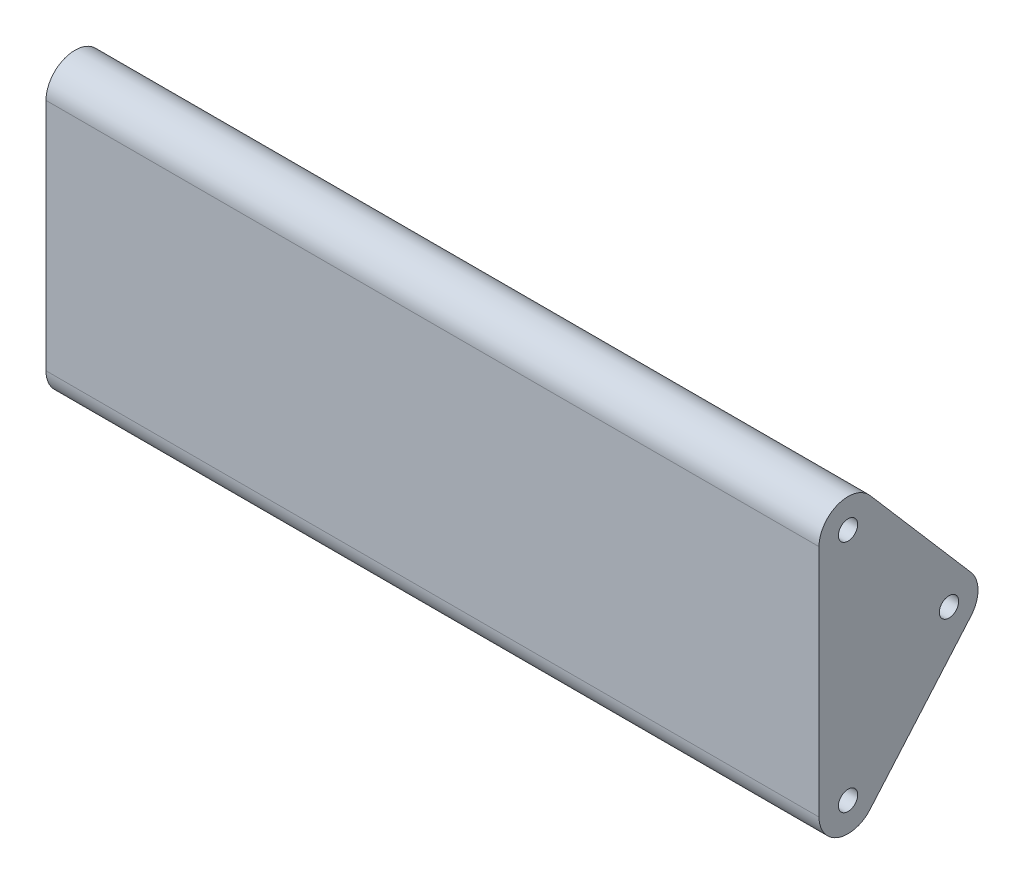
ISO-10303-21;
HEADER;
FILE_DESCRIPTION(('STEP AP214'),'2;1');
FILE_NAME('part.step','',(''),(''),'','','');
FILE_SCHEMA(('AUTOMOTIVE_DESIGN { 1 0 10303 214 1 1 1 1 }'));
ENDSEC;
DATA;
#1=APPLICATION_CONTEXT('core data for automotive mechanical design processes');
#2=APPLICATION_PROTOCOL_DEFINITION('international standard','automotive_design',2000,#1);
#3=PRODUCT_CONTEXT('',#1,'mechanical');
#4=PRODUCT('Part','Part','',(#3));
#5=PRODUCT_RELATED_PRODUCT_CATEGORY('part','',(#4));
#6=PRODUCT_DEFINITION_FORMATION('','',#4);
#7=PRODUCT_DEFINITION_CONTEXT('part definition',#1,'design');
#8=PRODUCT_DEFINITION('design','',#6,#7);
#9=PRODUCT_DEFINITION_SHAPE('','',#8);
#10=(LENGTH_UNIT() NAMED_UNIT(*) SI_UNIT(.MILLI.,.METRE.));
#11=(NAMED_UNIT(*) PLANE_ANGLE_UNIT() SI_UNIT($,.RADIAN.));
#12=(NAMED_UNIT(*) SI_UNIT($,.STERADIAN.) SOLID_ANGLE_UNIT());
#13=UNCERTAINTY_MEASURE_WITH_UNIT(LENGTH_MEASURE(1.E-05),#10,'distance_accuracy_value','');
#14=(GEOMETRIC_REPRESENTATION_CONTEXT(3) GLOBAL_UNCERTAINTY_ASSIGNED_CONTEXT((#13)) GLOBAL_UNIT_ASSIGNED_CONTEXT((#10,
#11,#12)) REPRESENTATION_CONTEXT('',''));
#15=CARTESIAN_POINT('',(0.,0.,0.));
#16=DIRECTION('',(0.,0.,1.));
#17=DIRECTION('',(1.,0.,0.));
#18=AXIS2_PLACEMENT_3D('',#15,#16,#17);
#19=CARTESIAN_POINT('',(10.,-4.94746405195682,13.6231964941302));
#20=DIRECTION('',(1.,0.,0.));
#21=DIRECTION('',(0.,0.,-1.));
#22=AXIS2_PLACEMENT_3D('',#19,#20,#21);
#23=PLANE('',#22);
#24=CARTESIAN_POINT('',(10.,-4.94746405195682,13.6231964941302));
#25=DIRECTION('',(1.,0.,0.));
#26=DIRECTION('',(0.,0.,-1.));
#27=AXIS2_PLACEMENT_3D('',#24,#25,#26);
#28=CIRCLE('',#27,0.125);
#29=CARTESIAN_POINT('',(10.,-4.94746405195682,13.4981964941302));
#30=VERTEX_POINT('',#29);
#31=EDGE_CURVE('E184',#30,#30,#28,.T.);
#32=ORIENTED_EDGE('',*,*,#31,.F.);
#33=EDGE_LOOP('',(#32));
#34=FACE_BOUND('',#33,.T.);
#35=CARTESIAN_POINT('',(10.,-4.94746405195682,13.6231964941302));
#36=DIRECTION('',(1.,0.,0.));
#37=DIRECTION('',(0.,0.,-1.));
#38=AXIS2_PLACEMENT_3D('',#35,#36,#37);
#39=CIRCLE('',#38,0.375);
#40=CARTESIAN_POINT('',(10.,-4.70255648658667,13.3392153602068));
#41=VERTEX_POINT('',#40);
#42=CARTESIAN_POINT('',(10.,-4.94746405195682,13.9981964941302));
#43=VERTEX_POINT('',#42);
#44=EDGE_CURVE('E129',#41,#43,#39,.T.);
#45=ORIENTED_EDGE('',*,*,#44,.T.);
#46=DIRECTION('',(0.,-1.,0.));
#47=VECTOR('',#46,1.);
#48=CARTESIAN_POINT('',(10.,-4.94746405195682,13.9981964941302));
#49=LINE('',#48,#47);
#50=CARTESIAN_POINT('',(10.,-7.97659614714057,13.9981964941302));
#51=VERTEX_POINT('',#50);
#52=EDGE_CURVE('E87',#43,#51,#49,.T.);
#53=ORIENTED_EDGE('',*,*,#52,.T.);
#54=CARTESIAN_POINT('',(10.,-7.97659614714057,13.6231964941302));
#55=DIRECTION('',(1.,0.,0.));
#56=DIRECTION('',(0.,0.,-1.));
#57=AXIS2_PLACEMENT_3D('',#54,#55,#56);
#58=CIRCLE('',#57,0.375000000000001);
#59=CARTESIAN_POINT('',(10.,-8.22150371251073,13.3392153602068));
#60=VERTEX_POINT('',#59);
#61=EDGE_CURVE('E100',#51,#60,#58,.T.);
#62=ORIENTED_EDGE('',*,*,#61,.T.);
#63=DIRECTION('',(0.,0.757283023795936,-0.65308684098708));
#64=VECTOR('',#63,1.);
#65=CARTESIAN_POINT('',(10.,-8.22150371251073,13.3392153602068));
#66=LINE('',#65,#64);
#67=CARTESIAN_POINT('',(10.,-6.70693766491885,12.0330416782326));
#68=VERTEX_POINT('',#67);
#69=EDGE_CURVE('E94',#60,#68,#66,.T.);
#70=ORIENTED_EDGE('',*,*,#69,.T.);
#71=CARTESIAN_POINT('',(10.,-6.4620300995487,12.3170228121561));
#72=DIRECTION('',(1.,0.,0.));
#73=DIRECTION('',(0.,0.,-1.));
#74=AXIS2_PLACEMENT_3D('',#71,#72,#73);
#75=CIRCLE('',#74,0.375000000000002);
#76=CARTESIAN_POINT('',(10.,-6.21712253417854,12.0330416782326));
#77=VERTEX_POINT('',#76);
#78=EDGE_CURVE('E98',#68,#77,#75,.T.);
#79=ORIENTED_EDGE('',*,*,#78,.T.);
#80=DIRECTION('',(0.,0.757283023795935,0.653086840987082));
#81=VECTOR('',#80,1.);
#82=CARTESIAN_POINT('',(10.,-4.70255648658667,13.3392153602068));
#83=LINE('',#82,#81);
#84=EDGE_CURVE('E50',#77,#41,#83,.T.);
#85=ORIENTED_EDGE('',*,*,#84,.T.);
#86=EDGE_LOOP('',(#45,#53,#62,#70,#79,#85));
#87=FACE_BOUND('',#86,.T.);
#88=CARTESIAN_POINT('',(10.,-7.97659614714057,13.6231964941302));
#89=DIRECTION('',(1.,0.,0.));
#90=DIRECTION('',(0.,0.,-1.));
#91=AXIS2_PLACEMENT_3D('',#88,#89,#90);
#92=CIRCLE('',#91,0.125);
#93=CARTESIAN_POINT('',(10.,-7.97659614714057,13.4981964941302));
#94=VERTEX_POINT('',#93);
#95=EDGE_CURVE('E122',#94,#94,#92,.T.);
#96=ORIENTED_EDGE('',*,*,#95,.F.);
#97=EDGE_LOOP('',(#96));
#98=FACE_BOUND('',#97,.T.);
#99=CARTESIAN_POINT('',(10.,-6.4620300995487,12.3170228121561));
#100=DIRECTION('',(1.,0.,0.));
#101=DIRECTION('',(0.,0.,-1.));
#102=AXIS2_PLACEMENT_3D('',#99,#100,#101);
#103=CIRCLE('',#102,0.125);
#104=CARTESIAN_POINT('',(10.,-6.4620300995487,12.1920228121561));
#105=VERTEX_POINT('',#104);
#106=EDGE_CURVE('E175',#105,#105,#103,.T.);
#107=ORIENTED_EDGE('',*,*,#106,.F.);
#108=EDGE_LOOP('',(#107));
#109=FACE_BOUND('',#108,.T.);
#110=ADVANCED_FACE('F33',(#34,#87,#98,#109),#23,.T.);
#111=CARTESIAN_POINT('',(0.,-4.94746405195682,13.6231964941302));
#112=DIRECTION('',(1.,0.,0.));
#113=DIRECTION('',(0.,0.,-1.));
#114=AXIS2_PLACEMENT_3D('',#111,#112,#113);
#115=PLANE('',#114);
#116=CARTESIAN_POINT('',(0.,-4.94746405195682,13.6231964941302));
#117=DIRECTION('',(1.,0.,0.));
#118=DIRECTION('',(0.,0.,-1.));
#119=AXIS2_PLACEMENT_3D('',#116,#117,#118);
#120=CIRCLE('',#119,0.375);
#121=CARTESIAN_POINT('',(0.,-4.70255648658667,13.3392153602068));
#122=VERTEX_POINT('',#121);
#123=CARTESIAN_POINT('',(0.,-4.94746405195682,13.9981964941302));
#124=VERTEX_POINT('',#123);
#125=EDGE_CURVE('E118',#122,#124,#120,.T.);
#126=ORIENTED_EDGE('',*,*,#125,.F.);
#127=DIRECTION('',(0.,0.757283023795935,0.653086840987082));
#128=VECTOR('',#127,1.);
#129=CARTESIAN_POINT('',(0.,-4.70255648658667,13.3392153602068));
#130=LINE('',#129,#128);
#131=CARTESIAN_POINT('',(0.,-6.21712253417854,12.0330416782326));
#132=VERTEX_POINT('',#131);
#133=EDGE_CURVE('E79',#132,#122,#130,.T.);
#134=ORIENTED_EDGE('',*,*,#133,.F.);
#135=CARTESIAN_POINT('',(0.,-6.4620300995487,12.3170228121561));
#136=DIRECTION('',(1.,0.,0.));
#137=DIRECTION('',(0.,0.,-1.));
#138=AXIS2_PLACEMENT_3D('',#135,#136,#137);
#139=CIRCLE('',#138,0.375000000000002);
#140=CARTESIAN_POINT('',(0.,-6.70693766491885,12.0330416782326));
#141=VERTEX_POINT('',#140);
#142=EDGE_CURVE('E73',#141,#132,#139,.T.);
#143=ORIENTED_EDGE('',*,*,#142,.F.);
#144=DIRECTION('',(0.,0.757283023795936,-0.65308684098708));
#145=VECTOR('',#144,1.);
#146=CARTESIAN_POINT('',(0.,-8.22150371251073,13.3392153602068));
#147=LINE('',#146,#145);
#148=CARTESIAN_POINT('',(0.,-8.22150371251073,13.3392153602068));
#149=VERTEX_POINT('',#148);
#150=EDGE_CURVE('E108',#149,#141,#147,.T.);
#151=ORIENTED_EDGE('',*,*,#150,.F.);
#152=CARTESIAN_POINT('',(0.,-7.97659614714057,13.6231964941302));
#153=DIRECTION('',(1.,0.,0.));
#154=DIRECTION('',(0.,0.,-1.));
#155=AXIS2_PLACEMENT_3D('',#152,#153,#154);
#156=CIRCLE('',#155,0.375000000000001);
#157=CARTESIAN_POINT('',(0.,-7.97659614714057,13.9981964941302));
#158=VERTEX_POINT('',#157);
#159=EDGE_CURVE('E124',#158,#149,#156,.T.);
#160=ORIENTED_EDGE('',*,*,#159,.F.);
#161=DIRECTION('',(0.,-1.,0.));
#162=VECTOR('',#161,1.);
#163=CARTESIAN_POINT('',(0.,-4.94746405195682,13.9981964941302));
#164=LINE('',#163,#162);
#165=EDGE_CURVE('E121',#124,#158,#164,.T.);
#166=ORIENTED_EDGE('',*,*,#165,.F.);
#167=EDGE_LOOP('',(#126,#134,#143,#151,#160,#166));
#168=FACE_BOUND('',#167,.T.);
#169=CARTESIAN_POINT('',(0.,-7.97659614714057,13.6231964941302));
#170=DIRECTION('',(1.,0.,0.));
#171=DIRECTION('',(0.,0.,-1.));
#172=AXIS2_PLACEMENT_3D('',#169,#170,#171);
#173=CIRCLE('',#172,0.125);
#174=CARTESIAN_POINT('',(0.,-7.97659614714057,13.4981964941302));
#175=VERTEX_POINT('',#174);
#176=EDGE_CURVE('E187',#175,#175,#173,.T.);
#177=ORIENTED_EDGE('',*,*,#176,.T.);
#178=EDGE_LOOP('',(#177));
#179=FACE_BOUND('',#178,.T.);
#180=CARTESIAN_POINT('',(0.,-4.94746405195682,13.6231964941302));
#181=DIRECTION('',(1.,0.,0.));
#182=DIRECTION('',(0.,0.,-1.));
#183=AXIS2_PLACEMENT_3D('',#180,#181,#182);
#184=CIRCLE('',#183,0.125);
#185=CARTESIAN_POINT('',(0.,-4.94746405195682,13.4981964941302));
#186=VERTEX_POINT('',#185);
#187=EDGE_CURVE('E181',#186,#186,#184,.T.);
#188=ORIENTED_EDGE('',*,*,#187,.T.);
#189=EDGE_LOOP('',(#188));
#190=FACE_BOUND('',#189,.T.);
#191=CARTESIAN_POINT('',(0.,-6.4620300995487,12.3170228121561));
#192=DIRECTION('',(1.,0.,0.));
#193=DIRECTION('',(0.,0.,-1.));
#194=AXIS2_PLACEMENT_3D('',#191,#192,#193);
#195=CIRCLE('',#194,0.125);
#196=CARTESIAN_POINT('',(0.,-6.4620300995487,12.1920228121561));
#197=VERTEX_POINT('',#196);
#198=EDGE_CURVE('E178',#197,#197,#195,.T.);
#199=ORIENTED_EDGE('',*,*,#198,.T.);
#200=EDGE_LOOP('',(#199));
#201=FACE_BOUND('',#200,.T.);
#202=ADVANCED_FACE('F138',(#168,#179,#190,#201),#115,.F.);
#203=CARTESIAN_POINT('',(10.,-4.94746405195682,13.6231964941302));
#204=DIRECTION('',(-1.,0.,0.));
#205=DIRECTION('',(0.,0.,1.));
#206=AXIS2_PLACEMENT_3D('',#203,#204,#205);
#207=CYLINDRICAL_SURFACE('',#206,0.375);
#208=ORIENTED_EDGE('',*,*,#125,.T.);
#209=DIRECTION('',(-1.,0.,0.));
#210=VECTOR('',#209,1.);
#211=CARTESIAN_POINT('',(10.,-4.94746405195682,13.9981964941302));
#212=LINE('',#211,#210);
#213=EDGE_CURVE('E11',#43,#124,#212,.T.);
#214=ORIENTED_EDGE('',*,*,#213,.F.);
#215=ORIENTED_EDGE('',*,*,#44,.F.);
#216=DIRECTION('',(-1.,0.,0.));
#217=VECTOR('',#216,1.);
#218=CARTESIAN_POINT('',(10.,-4.70255648658667,13.3392153602068));
#219=LINE('',#218,#217);
#220=EDGE_CURVE('E114',#41,#122,#219,.T.);
#221=ORIENTED_EDGE('',*,*,#220,.T.);
#222=EDGE_LOOP('',(#208,#214,#215,#221));
#223=FACE_BOUND('',#222,.T.);
#224=ADVANCED_FACE('F35',(#223),#207,.T.);
#225=CARTESIAN_POINT('',(10.,-4.94746405195682,13.9981964941302));
#226=DIRECTION('',(0.,0.,-1.));
#227=DIRECTION('',(-1.,0.,0.));
#228=AXIS2_PLACEMENT_3D('',#225,#226,#227);
#229=PLANE('',#228);
#230=ORIENTED_EDGE('',*,*,#165,.T.);
#231=DIRECTION('',(-1.,0.,0.));
#232=VECTOR('',#231,1.);
#233=CARTESIAN_POINT('',(10.,-7.97659614714057,13.9981964941302));
#234=LINE('',#233,#232);
#235=EDGE_CURVE('E42',#51,#158,#234,.T.);
#236=ORIENTED_EDGE('',*,*,#235,.F.);
#237=ORIENTED_EDGE('',*,*,#52,.F.);
#238=ORIENTED_EDGE('',*,*,#213,.T.);
#239=EDGE_LOOP('',(#230,#236,#237,#238));
#240=FACE_BOUND('',#239,.T.);
#241=ADVANCED_FACE('F237',(#240),#229,.F.);
#242=CARTESIAN_POINT('',(10.,-7.97659614714057,13.6231964941302));
#243=DIRECTION('',(-1.,0.,0.));
#244=DIRECTION('',(0.,0.,1.));
#245=AXIS2_PLACEMENT_3D('',#242,#243,#244);
#246=CYLINDRICAL_SURFACE('',#245,0.375000000000001);
#247=ORIENTED_EDGE('',*,*,#159,.T.);
#248=DIRECTION('',(-1.,0.,0.));
#249=VECTOR('',#248,1.);
#250=CARTESIAN_POINT('',(10.,-8.22150371251073,13.3392153602068));
#251=LINE('',#250,#249);
#252=EDGE_CURVE('E109',#60,#149,#251,.T.);
#253=ORIENTED_EDGE('',*,*,#252,.F.);
#254=ORIENTED_EDGE('',*,*,#61,.F.);
#255=ORIENTED_EDGE('',*,*,#235,.T.);
#256=EDGE_LOOP('',(#247,#253,#254,#255));
#257=FACE_BOUND('',#256,.T.);
#258=ADVANCED_FACE('F135',(#257),#246,.T.);
#259=CARTESIAN_POINT('',(10.,-8.22150371251073,13.3392153602068));
#260=DIRECTION('',(0.,0.65308684098708,0.757283023795936));
#261=DIRECTION('',(0.,-0.757283023795936,0.65308684098708));
#262=AXIS2_PLACEMENT_3D('',#259,#260,#261);
#263=PLANE('',#262);
#264=ORIENTED_EDGE('',*,*,#150,.T.);
#265=DIRECTION('',(-1.,0.,0.));
#266=VECTOR('',#265,1.);
#267=CARTESIAN_POINT('',(10.,-6.70693766491885,12.0330416782326));
#268=LINE('',#267,#266);
#269=EDGE_CURVE('E105',#68,#141,#268,.T.);
#270=ORIENTED_EDGE('',*,*,#269,.F.);
#271=ORIENTED_EDGE('',*,*,#69,.F.);
#272=ORIENTED_EDGE('',*,*,#252,.T.);
#273=EDGE_LOOP('',(#264,#270,#271,#272));
#274=FACE_BOUND('',#273,.T.);
#275=ADVANCED_FACE('F106',(#274),#263,.F.);
#276=CARTESIAN_POINT('',(10.,-6.4620300995487,12.3170228121561));
#277=DIRECTION('',(-1.,0.,0.));
#278=DIRECTION('',(0.,0.,1.));
#279=AXIS2_PLACEMENT_3D('',#276,#277,#278);
#280=CYLINDRICAL_SURFACE('',#279,0.375000000000002);
#281=ORIENTED_EDGE('',*,*,#142,.T.);
#282=DIRECTION('',(-1.,0.,0.));
#283=VECTOR('',#282,1.);
#284=CARTESIAN_POINT('',(10.,-6.21712253417854,12.0330416782326));
#285=LINE('',#284,#283);
#286=EDGE_CURVE('E110',#77,#132,#285,.T.);
#287=ORIENTED_EDGE('',*,*,#286,.F.);
#288=ORIENTED_EDGE('',*,*,#78,.F.);
#289=ORIENTED_EDGE('',*,*,#269,.T.);
#290=EDGE_LOOP('',(#281,#287,#288,#289));
#291=FACE_BOUND('',#290,.T.);
#292=ADVANCED_FACE('F112',(#291),#280,.T.);
#293=CARTESIAN_POINT('',(10.,-4.70255648658667,13.3392153602068));
#294=DIRECTION('',(0.,-0.653086840987082,0.757283023795935));
#295=DIRECTION('',(0.,-0.757283023795935,-0.653086840987082));
#296=AXIS2_PLACEMENT_3D('',#293,#294,#295);
#297=PLANE('',#296);
#298=ORIENTED_EDGE('',*,*,#133,.T.);
#299=ORIENTED_EDGE('',*,*,#220,.F.);
#300=ORIENTED_EDGE('',*,*,#84,.F.);
#301=ORIENTED_EDGE('',*,*,#286,.T.);
#302=EDGE_LOOP('',(#298,#299,#300,#301));
#303=FACE_BOUND('',#302,.T.);
#304=ADVANCED_FACE('F143',(#303),#297,.F.);
#305=CARTESIAN_POINT('',(10.,-7.97659614714057,13.6231964941302));
#306=DIRECTION('',(-1.,0.,0.));
#307=DIRECTION('',(0.,0.,1.));
#308=AXIS2_PLACEMENT_3D('',#305,#306,#307);
#309=CYLINDRICAL_SURFACE('',#308,0.125);
#310=ORIENTED_EDGE('',*,*,#95,.T.);
#311=EDGE_LOOP('',(#310));
#312=FACE_BOUND('',#311,.T.);
#313=ORIENTED_EDGE('',*,*,#176,.F.);
#314=EDGE_LOOP('',(#313));
#315=FACE_BOUND('',#314,.T.);
#316=ADVANCED_FACE('F145',(#312,#315),#309,.F.);
#317=CARTESIAN_POINT('',(10.,-4.94746405195682,13.6231964941302));
#318=DIRECTION('',(-1.,0.,0.));
#319=DIRECTION('',(0.,0.,1.));
#320=AXIS2_PLACEMENT_3D('',#317,#318,#319);
#321=CYLINDRICAL_SURFACE('',#320,0.125);
#322=ORIENTED_EDGE('',*,*,#31,.T.);
#323=EDGE_LOOP('',(#322));
#324=FACE_BOUND('',#323,.T.);
#325=ORIENTED_EDGE('',*,*,#187,.F.);
#326=EDGE_LOOP('',(#325));
#327=FACE_BOUND('',#326,.T.);
#328=ADVANCED_FACE('F151',(#324,#327),#321,.F.);
#329=CARTESIAN_POINT('',(10.,-6.4620300995487,12.3170228121561));
#330=DIRECTION('',(-1.,0.,0.));
#331=DIRECTION('',(0.,0.,1.));
#332=AXIS2_PLACEMENT_3D('',#329,#330,#331);
#333=CYLINDRICAL_SURFACE('',#332,0.125);
#334=ORIENTED_EDGE('',*,*,#106,.T.);
#335=EDGE_LOOP('',(#334));
#336=FACE_BOUND('',#335,.T.);
#337=ORIENTED_EDGE('',*,*,#198,.F.);
#338=EDGE_LOOP('',(#337));
#339=FACE_BOUND('',#338,.T.);
#340=ADVANCED_FACE('F166',(#336,#339),#333,.F.);
#341=CLOSED_SHELL('',(#110,#202,#224,#241,#258,#275,#292,#304,#316,#328,#340));
#342=MANIFOLD_SOLID_BREP('B2',#341);
#343=ADVANCED_BREP_SHAPE_REPRESENTATION('',(#18,#342),#14);
#344=SHAPE_DEFINITION_REPRESENTATION(#9,#343);
ENDSEC;
END-ISO-10303-21;
